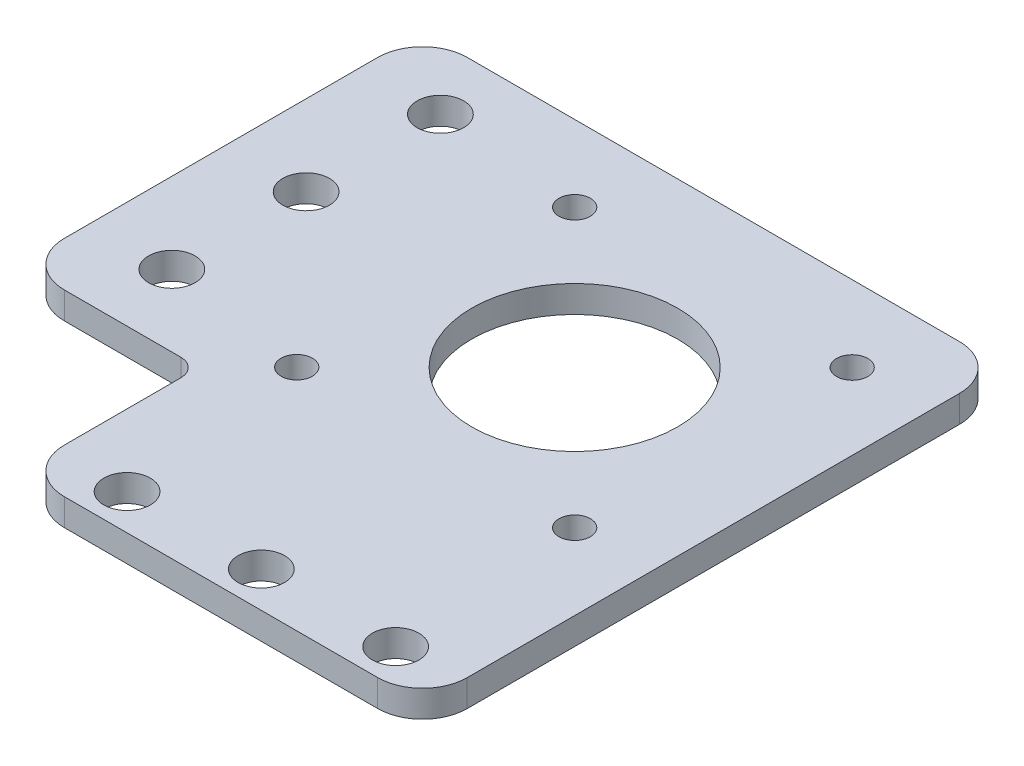
ISO-10303-21;
HEADER;
FILE_DESCRIPTION(('STEP AP214'),'2;1');
FILE_NAME('part.step','',(''),(''),'','','');
FILE_SCHEMA(('AUTOMOTIVE_DESIGN { 1 0 10303 214 1 1 1 1 }'));
ENDSEC;
DATA;
#1=APPLICATION_CONTEXT('core data for automotive mechanical design processes');
#2=APPLICATION_PROTOCOL_DEFINITION('international standard','automotive_design',2000,#1);
#3=PRODUCT_CONTEXT('',#1,'mechanical');
#4=PRODUCT('Part','Part','',(#3));
#5=PRODUCT_RELATED_PRODUCT_CATEGORY('part','',(#4));
#6=PRODUCT_DEFINITION_FORMATION('','',#4);
#7=PRODUCT_DEFINITION_CONTEXT('part definition',#1,'design');
#8=PRODUCT_DEFINITION('design','',#6,#7);
#9=PRODUCT_DEFINITION_SHAPE('','',#8);
#10=(LENGTH_UNIT() NAMED_UNIT(*) SI_UNIT(.MILLI.,.METRE.));
#11=(NAMED_UNIT(*) PLANE_ANGLE_UNIT() SI_UNIT($,.RADIAN.));
#12=(NAMED_UNIT(*) SI_UNIT($,.STERADIAN.) SOLID_ANGLE_UNIT());
#13=UNCERTAINTY_MEASURE_WITH_UNIT(LENGTH_MEASURE(1.E-05),#10,'distance_accuracy_value','');
#14=(GEOMETRIC_REPRESENTATION_CONTEXT(3) GLOBAL_UNCERTAINTY_ASSIGNED_CONTEXT((#13)) GLOBAL_UNIT_ASSIGNED_CONTEXT((#10,
#11,#12)) REPRESENTATION_CONTEXT('',''));
#15=CARTESIAN_POINT('',(0.,0.,0.));
#16=DIRECTION('',(0.,0.,1.));
#17=DIRECTION('',(1.,0.,0.));
#18=AXIS2_PLACEMENT_3D('',#15,#16,#17);
#19=CARTESIAN_POINT('',(20.,-3.,-5.));
#20=DIRECTION('',(-1.,0.,0.));
#21=DIRECTION('',(0.,0.,1.));
#22=AXIS2_PLACEMENT_3D('',#19,#20,#21);
#23=PLANE('',#22);
#24=DIRECTION('',(0.,0.,1.));
#25=VECTOR('',#24,1.);
#26=CARTESIAN_POINT('',(20.,0.,-5.));
#27=LINE('',#26,#25);
#28=CARTESIAN_POINT('',(20.,0.,-23.));
#29=VERTEX_POINT('',#28);
#30=CARTESIAN_POINT('',(20.,0.,-10.));
#31=VERTEX_POINT('',#30);
#32=EDGE_CURVE('E217',#29,#31,#27,.T.);
#33=ORIENTED_EDGE('',*,*,#32,.F.);
#34=DIRECTION('',(0.,1.,0.));
#35=VECTOR('',#34,1.);
#36=CARTESIAN_POINT('',(20.,-3.,-23.));
#37=LINE('',#36,#35);
#38=CARTESIAN_POINT('',(20.,-3.,-23.));
#39=VERTEX_POINT('',#38);
#40=EDGE_CURVE('E60',#29,#39,#37,.F.);
#41=ORIENTED_EDGE('',*,*,#40,.T.);
#42=DIRECTION('',(0.,0.,1.));
#43=VECTOR('',#42,1.);
#44=CARTESIAN_POINT('',(20.,-3.,-5.));
#45=LINE('',#44,#43);
#46=CARTESIAN_POINT('',(20.,-3.,-10.));
#47=VERTEX_POINT('',#46);
#48=EDGE_CURVE('E208',#39,#47,#45,.T.);
#49=ORIENTED_EDGE('',*,*,#48,.T.);
#50=DIRECTION('',(0.,1.,0.));
#51=VECTOR('',#50,1.);
#52=CARTESIAN_POINT('',(20.,-3.,-10.));
#53=LINE('',#52,#51);
#54=EDGE_CURVE('E184',#47,#31,#53,.T.);
#55=ORIENTED_EDGE('',*,*,#54,.T.);
#56=EDGE_LOOP('',(#33,#41,#49,#55));
#57=FACE_BOUND('',#56,.T.);
#58=ADVANCED_FACE('F39',(#57),#23,.T.);
#59=CARTESIAN_POINT('',(20.,-3.,-25.));
#60=DIRECTION('',(0.,0.,1.));
#61=DIRECTION('',(1.,0.,0.));
#62=AXIS2_PLACEMENT_3D('',#59,#60,#61);
#63=PLANE('',#62);
#64=DIRECTION('',(1.,0.,0.));
#65=VECTOR('',#64,1.);
#66=CARTESIAN_POINT('',(20.,-3.,-25.));
#67=LINE('',#66,#65);
#68=CARTESIAN_POINT('',(5.,-3.,-25.));
#69=VERTEX_POINT('',#68);
#70=CARTESIAN_POINT('',(18.,-3.,-25.));
#71=VERTEX_POINT('',#70);
#72=EDGE_CURVE('E151',#69,#71,#67,.T.);
#73=ORIENTED_EDGE('',*,*,#72,.T.);
#74=DIRECTION('',(0.,1.,0.));
#75=VECTOR('',#74,1.);
#76=CARTESIAN_POINT('',(18.,0.,-25.));
#77=LINE('',#76,#75);
#78=CARTESIAN_POINT('',(18.,0.,-25.));
#79=VERTEX_POINT('',#78);
#80=EDGE_CURVE('E196',#71,#79,#77,.T.);
#81=ORIENTED_EDGE('',*,*,#80,.T.);
#82=DIRECTION('',(1.,0.,0.));
#83=VECTOR('',#82,1.);
#84=CARTESIAN_POINT('',(20.,0.,-25.));
#85=LINE('',#84,#83);
#86=CARTESIAN_POINT('',(5.,0.,-25.));
#87=VERTEX_POINT('',#86);
#88=EDGE_CURVE('E158',#87,#79,#85,.T.);
#89=ORIENTED_EDGE('',*,*,#88,.F.);
#90=DIRECTION('',(0.,1.,0.));
#91=VECTOR('',#90,1.);
#92=CARTESIAN_POINT('',(5.,-3.,-25.));
#93=LINE('',#92,#91);
#94=EDGE_CURVE('E182',#87,#69,#93,.F.);
#95=ORIENTED_EDGE('',*,*,#94,.T.);
#96=EDGE_LOOP('',(#73,#81,#89,#95));
#97=FACE_BOUND('',#96,.T.);
#98=ADVANCED_FACE('F202',(#97),#63,.T.);
#99=CARTESIAN_POINT('',(0.,-3.,-25.));
#100=DIRECTION('',(-1.,0.,0.));
#101=DIRECTION('',(0.,0.,1.));
#102=AXIS2_PLACEMENT_3D('',#99,#100,#101);
#103=PLANE('',#102);
#104=DIRECTION('',(0.,0.,1.));
#105=VECTOR('',#104,1.);
#106=CARTESIAN_POINT('',(0.,0.,-25.));
#107=LINE('',#106,#105);
#108=CARTESIAN_POINT('',(0.,0.,-65.));
#109=VERTEX_POINT('',#108);
#110=CARTESIAN_POINT('',(0.,0.,-30.));
#111=VERTEX_POINT('',#110);
#112=EDGE_CURVE('E146',#109,#111,#107,.T.);
#113=ORIENTED_EDGE('',*,*,#112,.F.);
#114=DIRECTION('',(0.,1.,0.));
#115=VECTOR('',#114,1.);
#116=CARTESIAN_POINT('',(0.,-3.,-65.));
#117=LINE('',#116,#115);
#118=CARTESIAN_POINT('',(0.,-3.,-65.));
#119=VERTEX_POINT('',#118);
#120=EDGE_CURVE('E170',#109,#119,#117,.F.);
#121=ORIENTED_EDGE('',*,*,#120,.T.);
#122=DIRECTION('',(0.,0.,1.));
#123=VECTOR('',#122,1.);
#124=CARTESIAN_POINT('',(0.,-3.,-25.));
#125=LINE('',#124,#123);
#126=CARTESIAN_POINT('',(0.,-3.,-30.));
#127=VERTEX_POINT('',#126);
#128=EDGE_CURVE('E155',#119,#127,#125,.T.);
#129=ORIENTED_EDGE('',*,*,#128,.T.);
#130=DIRECTION('',(0.,1.,0.));
#131=VECTOR('',#130,1.);
#132=CARTESIAN_POINT('',(0.,-3.,-30.));
#133=LINE('',#132,#131);
#134=EDGE_CURVE('E167',#127,#111,#133,.T.);
#135=ORIENTED_EDGE('',*,*,#134,.T.);
#136=EDGE_LOOP('',(#113,#121,#129,#135));
#137=FACE_BOUND('',#136,.T.);
#138=ADVANCED_FACE('F347',(#137),#103,.T.);
#139=CARTESIAN_POINT('',(0.,-3.,-70.));
#140=DIRECTION('',(0.,0.,-1.));
#141=DIRECTION('',(-1.,0.,0.));
#142=AXIS2_PLACEMENT_3D('',#139,#140,#141);
#143=PLANE('',#142);
#144=DIRECTION('',(-1.,0.,0.));
#145=VECTOR('',#144,1.);
#146=CARTESIAN_POINT('',(0.,-3.,-70.));
#147=LINE('',#146,#145);
#148=CARTESIAN_POINT('',(60.,-3.,-70.));
#149=VERTEX_POINT('',#148);
#150=CARTESIAN_POINT('',(4.99999999999999,-3.,-70.));
#151=VERTEX_POINT('',#150);
#152=EDGE_CURVE('E222',#149,#151,#147,.T.);
#153=ORIENTED_EDGE('',*,*,#152,.T.);
#154=DIRECTION('',(0.,1.,0.));
#155=VECTOR('',#154,1.);
#156=CARTESIAN_POINT('',(4.99999999999999,-3.,-70.));
#157=LINE('',#156,#155);
#158=CARTESIAN_POINT('',(4.99999999999999,0.,-70.));
#159=VERTEX_POINT('',#158);
#160=EDGE_CURVE('E145',#151,#159,#157,.T.);
#161=ORIENTED_EDGE('',*,*,#160,.T.);
#162=DIRECTION('',(-1.,0.,0.));
#163=VECTOR('',#162,1.);
#164=CARTESIAN_POINT('',(0.,0.,-70.));
#165=LINE('',#164,#163);
#166=CARTESIAN_POINT('',(60.,0.,-70.));
#167=VERTEX_POINT('',#166);
#168=EDGE_CURVE('E128',#167,#159,#165,.T.);
#169=ORIENTED_EDGE('',*,*,#168,.F.);
#170=DIRECTION('',(0.,1.,0.));
#171=VECTOR('',#170,1.);
#172=CARTESIAN_POINT('',(60.,-3.,-70.));
#173=LINE('',#172,#171);
#174=EDGE_CURVE('E142',#167,#149,#173,.F.);
#175=ORIENTED_EDGE('',*,*,#174,.T.);
#176=EDGE_LOOP('',(#153,#161,#169,#175));
#177=FACE_BOUND('',#176,.T.);
#178=ADVANCED_FACE('F141',(#177),#143,.T.);
#179=CARTESIAN_POINT('',(65.,-3.,-70.));
#180=DIRECTION('',(1.,0.,0.));
#181=DIRECTION('',(0.,0.,-1.));
#182=AXIS2_PLACEMENT_3D('',#179,#180,#181);
#183=PLANE('',#182);
#184=DIRECTION('',(0.,0.,-1.));
#185=VECTOR('',#184,1.);
#186=CARTESIAN_POINT('',(65.,-3.,-70.));
#187=LINE('',#186,#185);
#188=CARTESIAN_POINT('',(65.,-3.,-10.));
#189=VERTEX_POINT('',#188);
#190=CARTESIAN_POINT('',(65.,-3.,-65.));
#191=VERTEX_POINT('',#190);
#192=EDGE_CURVE('E224',#189,#191,#187,.T.);
#193=ORIENTED_EDGE('',*,*,#192,.T.);
#194=DIRECTION('',(0.,1.,0.));
#195=VECTOR('',#194,1.);
#196=CARTESIAN_POINT('',(65.,-3.,-65.));
#197=LINE('',#196,#195);
#198=CARTESIAN_POINT('',(65.,0.,-65.));
#199=VERTEX_POINT('',#198);
#200=EDGE_CURVE('E194',#191,#199,#197,.T.);
#201=ORIENTED_EDGE('',*,*,#200,.T.);
#202=DIRECTION('',(0.,0.,-1.));
#203=VECTOR('',#202,1.);
#204=CARTESIAN_POINT('',(65.,0.,-70.));
#205=LINE('',#204,#203);
#206=CARTESIAN_POINT('',(65.,0.,-10.));
#207=VERTEX_POINT('',#206);
#208=EDGE_CURVE('E130',#207,#199,#205,.T.);
#209=ORIENTED_EDGE('',*,*,#208,.F.);
#210=DIRECTION('',(0.,1.,0.));
#211=VECTOR('',#210,1.);
#212=CARTESIAN_POINT('',(65.,-3.,-10.));
#213=LINE('',#212,#211);
#214=EDGE_CURVE('E192',#207,#189,#213,.F.);
#215=ORIENTED_EDGE('',*,*,#214,.T.);
#216=EDGE_LOOP('',(#193,#201,#209,#215));
#217=FACE_BOUND('',#216,.T.);
#218=ADVANCED_FACE('F385',(#217),#183,.T.);
#219=CARTESIAN_POINT('',(65.,-3.,-5.00000000000001));
#220=DIRECTION('',(0.,0.,1.));
#221=DIRECTION('',(1.,0.,0.));
#222=AXIS2_PLACEMENT_3D('',#219,#220,#221);
#223=PLANE('',#222);
#224=DIRECTION('',(1.,0.,0.));
#225=VECTOR('',#224,1.);
#226=CARTESIAN_POINT('',(65.,0.,-5.00000000000001));
#227=LINE('',#226,#225);
#228=CARTESIAN_POINT('',(25.,0.,-5.));
#229=VERTEX_POINT('',#228);
#230=CARTESIAN_POINT('',(60.,0.,-5.00000000000001));
#231=VERTEX_POINT('',#230);
#232=EDGE_CURVE('E214',#229,#231,#227,.T.);
#233=ORIENTED_EDGE('',*,*,#232,.F.);
#234=DIRECTION('',(0.,1.,0.));
#235=VECTOR('',#234,1.);
#236=CARTESIAN_POINT('',(25.,-3.,-5.));
#237=LINE('',#236,#235);
#238=CARTESIAN_POINT('',(25.,-3.,-5.));
#239=VERTEX_POINT('',#238);
#240=EDGE_CURVE('E190',#229,#239,#237,.F.);
#241=ORIENTED_EDGE('',*,*,#240,.T.);
#242=DIRECTION('',(1.,0.,0.));
#243=VECTOR('',#242,1.);
#244=CARTESIAN_POINT('',(65.,-3.,-5.00000000000001));
#245=LINE('',#244,#243);
#246=CARTESIAN_POINT('',(60.,-3.,-5.00000000000001));
#247=VERTEX_POINT('',#246);
#248=EDGE_CURVE('E209',#239,#247,#245,.T.);
#249=ORIENTED_EDGE('',*,*,#248,.T.);
#250=DIRECTION('',(0.,1.,0.));
#251=VECTOR('',#250,1.);
#252=CARTESIAN_POINT('',(60.,-3.,-5.00000000000001));
#253=LINE('',#252,#251);
#254=EDGE_CURVE('E187',#247,#231,#253,.T.);
#255=ORIENTED_EDGE('',*,*,#254,.T.);
#256=EDGE_LOOP('',(#233,#241,#249,#255));
#257=FACE_BOUND('',#256,.T.);
#258=ADVANCED_FACE('F351',(#257),#223,.T.);
#259=CARTESIAN_POINT('',(0.,-3.,0.));
#260=DIRECTION('',(0.,1.,0.));
#261=DIRECTION('',(0.,0.,1.));
#262=AXIS2_PLACEMENT_3D('',#259,#260,#261);
#263=PLANE('',#262);
#264=CARTESIAN_POINT('',(41.,-3.,-46.));
#265=DIRECTION('',(0.,1.,0.));
#266=DIRECTION('',(0.,0.,1.));
#267=AXIS2_PLACEMENT_3D('',#264,#265,#266);
#268=CIRCLE('',#267,11.5);
#269=CARTESIAN_POINT('',(41.,-3.,-34.5));
#270=VERTEX_POINT('',#269);
#271=EDGE_CURVE('E286',#270,#270,#268,.T.);
#272=ORIENTED_EDGE('',*,*,#271,.T.);
#273=EDGE_LOOP('',(#272));
#274=FACE_BOUND('',#273,.T.);
#275=CARTESIAN_POINT('',(25.4491798195983,-3.,-30.5022938972961));
#276=DIRECTION('',(0.,1.,0.));
#277=DIRECTION('',(0.,0.,1.));
#278=AXIS2_PLACEMENT_3D('',#275,#276,#277);
#279=CIRCLE('',#278,1.75);
#280=CARTESIAN_POINT('',(25.4491798195983,-3.,-28.7522938972961));
#281=VERTEX_POINT('',#280);
#282=EDGE_CURVE('E280',#281,#281,#279,.T.);
#283=ORIENTED_EDGE('',*,*,#282,.T.);
#284=EDGE_LOOP('',(#283));
#285=FACE_BOUND('',#284,.T.);
#286=CARTESIAN_POINT('',(56.5,-3.,-30.5));
#287=DIRECTION('',(0.,1.,0.));
#288=DIRECTION('',(0.,0.,1.));
#289=AXIS2_PLACEMENT_3D('',#286,#287,#288);
#290=CIRCLE('',#289,1.75);
#291=CARTESIAN_POINT('',(56.5,-3.,-28.75));
#292=VERTEX_POINT('',#291);
#293=EDGE_CURVE('E274',#292,#292,#290,.T.);
#294=ORIENTED_EDGE('',*,*,#293,.T.);
#295=EDGE_LOOP('',(#294));
#296=FACE_BOUND('',#295,.T.);
#297=CARTESIAN_POINT('',(56.5,-3.,-61.5));
#298=DIRECTION('',(0.,1.,0.));
#299=DIRECTION('',(0.,0.,1.));
#300=AXIS2_PLACEMENT_3D('',#297,#298,#299);
#301=CIRCLE('',#300,1.75);
#302=CARTESIAN_POINT('',(56.5,-3.,-59.75));
#303=VERTEX_POINT('',#302);
#304=EDGE_CURVE('E268',#303,#303,#301,.T.);
#305=ORIENTED_EDGE('',*,*,#304,.T.);
#306=EDGE_LOOP('',(#305));
#307=FACE_BOUND('',#306,.T.);
#308=CARTESIAN_POINT('',(25.5,-3.,-61.5));
#309=DIRECTION('',(0.,1.,0.));
#310=DIRECTION('',(0.,0.,1.));
#311=AXIS2_PLACEMENT_3D('',#308,#309,#310);
#312=CIRCLE('',#311,1.75);
#313=CARTESIAN_POINT('',(25.5,-3.,-59.75));
#314=VERTEX_POINT('',#313);
#315=EDGE_CURVE('E262',#314,#314,#312,.T.);
#316=ORIENTED_EDGE('',*,*,#315,.T.);
#317=EDGE_LOOP('',(#316));
#318=FACE_BOUND('',#317,.T.);
#319=CARTESIAN_POINT('',(8.99999999999984,-3.,-63.));
#320=DIRECTION('',(0.,1.,0.));
#321=DIRECTION('',(0.,0.,1.));
#322=AXIS2_PLACEMENT_3D('',#319,#320,#321);
#323=CIRCLE('',#322,2.60000000000001);
#324=CARTESIAN_POINT('',(8.99999999999984,-3.,-60.4));
#325=VERTEX_POINT('',#324);
#326=EDGE_CURVE('E256',#325,#325,#323,.T.);
#327=ORIENTED_EDGE('',*,*,#326,.T.);
#328=EDGE_LOOP('',(#327));
#329=FACE_BOUND('',#328,.T.);
#330=CARTESIAN_POINT('',(8.9999999999999,-3.,-48.));
#331=DIRECTION('',(0.,1.,0.));
#332=DIRECTION('',(0.,0.,1.));
#333=AXIS2_PLACEMENT_3D('',#330,#331,#332);
#334=CIRCLE('',#333,2.6);
#335=CARTESIAN_POINT('',(8.9999999999999,-3.,-45.4));
#336=VERTEX_POINT('',#335);
#337=EDGE_CURVE('E250',#336,#336,#334,.T.);
#338=ORIENTED_EDGE('',*,*,#337,.T.);
#339=EDGE_LOOP('',(#338));
#340=FACE_BOUND('',#339,.T.);
#341=CARTESIAN_POINT('',(9.,-3.,-33.));
#342=DIRECTION('',(0.,1.,0.));
#343=DIRECTION('',(0.,0.,1.));
#344=AXIS2_PLACEMENT_3D('',#341,#342,#343);
#345=CIRCLE('',#344,2.6);
#346=CARTESIAN_POINT('',(9.,-3.,-30.4));
#347=VERTEX_POINT('',#346);
#348=EDGE_CURVE('E244',#347,#347,#345,.T.);
#349=ORIENTED_EDGE('',*,*,#348,.T.);
#350=EDGE_LOOP('',(#349));
#351=FACE_BOUND('',#350,.T.);
#352=CARTESIAN_POINT('',(58.,-3.,-8.99999999999999));
#353=DIRECTION('',(0.,1.,0.));
#354=DIRECTION('',(0.,0.,1.));
#355=AXIS2_PLACEMENT_3D('',#352,#353,#354);
#356=CIRCLE('',#355,2.59999999999997);
#357=CARTESIAN_POINT('',(58.,-3.,-6.40000000000003));
#358=VERTEX_POINT('',#357);
#359=EDGE_CURVE('E238',#358,#358,#356,.T.);
#360=ORIENTED_EDGE('',*,*,#359,.T.);
#361=EDGE_LOOP('',(#360));
#362=FACE_BOUND('',#361,.T.);
#363=CARTESIAN_POINT('',(43.,-3.,-8.99999999999999));
#364=DIRECTION('',(0.,1.,0.));
#365=DIRECTION('',(0.,0.,1.));
#366=AXIS2_PLACEMENT_3D('',#363,#364,#365);
#367=CIRCLE('',#366,2.6);
#368=CARTESIAN_POINT('',(43.,-3.,-6.39999999999999));
#369=VERTEX_POINT('',#368);
#370=EDGE_CURVE('E232',#369,#369,#367,.T.);
#371=ORIENTED_EDGE('',*,*,#370,.T.);
#372=EDGE_LOOP('',(#371));
#373=FACE_BOUND('',#372,.T.);
#374=CARTESIAN_POINT('',(28.,-3.,-8.99999999999999));
#375=DIRECTION('',(0.,1.,0.));
#376=DIRECTION('',(0.,0.,1.));
#377=AXIS2_PLACEMENT_3D('',#374,#375,#376);
#378=CIRCLE('',#377,2.6);
#379=CARTESIAN_POINT('',(28.,-3.,-6.39999999999999));
#380=VERTEX_POINT('',#379);
#381=EDGE_CURVE('E218',#380,#380,#378,.T.);
#382=ORIENTED_EDGE('',*,*,#381,.T.);
#383=EDGE_LOOP('',(#382));
#384=FACE_BOUND('',#383,.T.);
#385=ORIENTED_EDGE('',*,*,#128,.F.);
#386=CARTESIAN_POINT('',(4.99999999999999,-3.,-65.));
#387=DIRECTION('',(0.,1.,0.));
#388=DIRECTION('',(0.,0.,1.));
#389=AXIS2_PLACEMENT_3D('',#386,#387,#388);
#390=CIRCLE('',#389,5.);
#391=EDGE_CURVE('E180',#119,#151,#390,.F.);
#392=ORIENTED_EDGE('',*,*,#391,.T.);
#393=ORIENTED_EDGE('',*,*,#152,.F.);
#394=CARTESIAN_POINT('',(60.,-3.,-65.));
#395=DIRECTION('',(0.,1.,0.));
#396=DIRECTION('',(0.,0.,1.));
#397=AXIS2_PLACEMENT_3D('',#394,#395,#396);
#398=CIRCLE('',#397,5.);
#399=EDGE_CURVE('E150',#149,#191,#398,.F.);
#400=ORIENTED_EDGE('',*,*,#399,.T.);
#401=ORIENTED_EDGE('',*,*,#192,.F.);
#402=CARTESIAN_POINT('',(60.,-3.,-10.));
#403=DIRECTION('',(0.,1.,0.));
#404=DIRECTION('',(0.,0.,1.));
#405=AXIS2_PLACEMENT_3D('',#402,#403,#404);
#406=CIRCLE('',#405,5.);
#407=EDGE_CURVE('E172',#189,#247,#406,.F.);
#408=ORIENTED_EDGE('',*,*,#407,.T.);
#409=ORIENTED_EDGE('',*,*,#248,.F.);
#410=CARTESIAN_POINT('',(25.,-3.,-10.));
#411=DIRECTION('',(0.,1.,0.));
#412=DIRECTION('',(0.,0.,1.));
#413=AXIS2_PLACEMENT_3D('',#410,#411,#412);
#414=CIRCLE('',#413,5.);
#415=EDGE_CURVE('E175',#239,#47,#414,.F.);
#416=ORIENTED_EDGE('',*,*,#415,.T.);
#417=ORIENTED_EDGE('',*,*,#48,.F.);
#418=CARTESIAN_POINT('',(18.,-3.,-23.));
#419=DIRECTION('',(0.,1.,0.));
#420=DIRECTION('',(0.,0.,1.));
#421=AXIS2_PLACEMENT_3D('',#418,#419,#420);
#422=CIRCLE('',#421,2.);
#423=EDGE_CURVE('E11',#39,#71,#422,.T.);
#424=ORIENTED_EDGE('',*,*,#423,.T.);
#425=ORIENTED_EDGE('',*,*,#72,.F.);
#426=CARTESIAN_POINT('',(5.,-3.,-30.));
#427=DIRECTION('',(0.,1.,0.));
#428=DIRECTION('',(0.,0.,1.));
#429=AXIS2_PLACEMENT_3D('',#426,#427,#428);
#430=CIRCLE('',#429,5.);
#431=EDGE_CURVE('E178',#69,#127,#430,.F.);
#432=ORIENTED_EDGE('',*,*,#431,.T.);
#433=EDGE_LOOP('',(#385,#392,#393,#400,#401,#408,#409,#416,#417,#424,#425,#432));
#434=FACE_BOUND('',#433,.T.);
#435=ADVANCED_FACE('F295',(#274,#285,#296,#307,#318,#329,#340,#351,#362,#373,#384,#434),#263,.F.);
#436=CARTESIAN_POINT('',(0.,0.,0.));
#437=DIRECTION('',(0.,1.,0.));
#438=DIRECTION('',(0.,0.,1.));
#439=AXIS2_PLACEMENT_3D('',#436,#437,#438);
#440=PLANE('',#439);
#441=CARTESIAN_POINT('',(41.,0.,-46.));
#442=DIRECTION('',(0.,1.,0.));
#443=DIRECTION('',(0.,0.,1.));
#444=AXIS2_PLACEMENT_3D('',#441,#442,#443);
#445=CIRCLE('',#444,11.5);
#446=CARTESIAN_POINT('',(41.,0.,-34.5));
#447=VERTEX_POINT('',#446);
#448=EDGE_CURVE('E289',#447,#447,#445,.T.);
#449=ORIENTED_EDGE('',*,*,#448,.F.);
#450=EDGE_LOOP('',(#449));
#451=FACE_BOUND('',#450,.T.);
#452=CARTESIAN_POINT('',(25.4491798195983,0.,-30.5022938972961));
#453=DIRECTION('',(0.,1.,0.));
#454=DIRECTION('',(0.,0.,1.));
#455=AXIS2_PLACEMENT_3D('',#452,#453,#454);
#456=CIRCLE('',#455,1.75);
#457=CARTESIAN_POINT('',(25.4491798195983,0.,-28.7522938972961));
#458=VERTEX_POINT('',#457);
#459=EDGE_CURVE('E283',#458,#458,#456,.T.);
#460=ORIENTED_EDGE('',*,*,#459,.F.);
#461=EDGE_LOOP('',(#460));
#462=FACE_BOUND('',#461,.T.);
#463=CARTESIAN_POINT('',(56.5,0.,-30.5));
#464=DIRECTION('',(0.,1.,0.));
#465=DIRECTION('',(0.,0.,1.));
#466=AXIS2_PLACEMENT_3D('',#463,#464,#465);
#467=CIRCLE('',#466,1.75);
#468=CARTESIAN_POINT('',(56.5,0.,-28.75));
#469=VERTEX_POINT('',#468);
#470=EDGE_CURVE('E277',#469,#469,#467,.T.);
#471=ORIENTED_EDGE('',*,*,#470,.F.);
#472=EDGE_LOOP('',(#471));
#473=FACE_BOUND('',#472,.T.);
#474=CARTESIAN_POINT('',(56.5,0.,-61.5));
#475=DIRECTION('',(0.,1.,0.));
#476=DIRECTION('',(0.,0.,1.));
#477=AXIS2_PLACEMENT_3D('',#474,#475,#476);
#478=CIRCLE('',#477,1.75);
#479=CARTESIAN_POINT('',(56.5,0.,-59.75));
#480=VERTEX_POINT('',#479);
#481=EDGE_CURVE('E271',#480,#480,#478,.T.);
#482=ORIENTED_EDGE('',*,*,#481,.F.);
#483=EDGE_LOOP('',(#482));
#484=FACE_BOUND('',#483,.T.);
#485=CARTESIAN_POINT('',(25.5,0.,-61.5));
#486=DIRECTION('',(0.,1.,0.));
#487=DIRECTION('',(0.,0.,1.));
#488=AXIS2_PLACEMENT_3D('',#485,#486,#487);
#489=CIRCLE('',#488,1.75);
#490=CARTESIAN_POINT('',(25.5,0.,-59.75));
#491=VERTEX_POINT('',#490);
#492=EDGE_CURVE('E265',#491,#491,#489,.T.);
#493=ORIENTED_EDGE('',*,*,#492,.F.);
#494=EDGE_LOOP('',(#493));
#495=FACE_BOUND('',#494,.T.);
#496=CARTESIAN_POINT('',(8.99999999999984,0.,-63.));
#497=DIRECTION('',(0.,1.,0.));
#498=DIRECTION('',(0.,0.,1.));
#499=AXIS2_PLACEMENT_3D('',#496,#497,#498);
#500=CIRCLE('',#499,2.60000000000001);
#501=CARTESIAN_POINT('',(8.99999999999984,0.,-60.4));
#502=VERTEX_POINT('',#501);
#503=EDGE_CURVE('E259',#502,#502,#500,.T.);
#504=ORIENTED_EDGE('',*,*,#503,.F.);
#505=EDGE_LOOP('',(#504));
#506=FACE_BOUND('',#505,.T.);
#507=CARTESIAN_POINT('',(8.9999999999999,0.,-48.));
#508=DIRECTION('',(0.,1.,0.));
#509=DIRECTION('',(0.,0.,1.));
#510=AXIS2_PLACEMENT_3D('',#507,#508,#509);
#511=CIRCLE('',#510,2.6);
#512=CARTESIAN_POINT('',(8.9999999999999,0.,-45.4));
#513=VERTEX_POINT('',#512);
#514=EDGE_CURVE('E253',#513,#513,#511,.T.);
#515=ORIENTED_EDGE('',*,*,#514,.F.);
#516=EDGE_LOOP('',(#515));
#517=FACE_BOUND('',#516,.T.);
#518=CARTESIAN_POINT('',(9.,0.,-33.));
#519=DIRECTION('',(0.,1.,0.));
#520=DIRECTION('',(0.,0.,1.));
#521=AXIS2_PLACEMENT_3D('',#518,#519,#520);
#522=CIRCLE('',#521,2.6);
#523=CARTESIAN_POINT('',(9.,0.,-30.4));
#524=VERTEX_POINT('',#523);
#525=EDGE_CURVE('E247',#524,#524,#522,.T.);
#526=ORIENTED_EDGE('',*,*,#525,.F.);
#527=EDGE_LOOP('',(#526));
#528=FACE_BOUND('',#527,.T.);
#529=CARTESIAN_POINT('',(58.,0.,-8.99999999999999));
#530=DIRECTION('',(0.,1.,0.));
#531=DIRECTION('',(0.,0.,1.));
#532=AXIS2_PLACEMENT_3D('',#529,#530,#531);
#533=CIRCLE('',#532,2.59999999999997);
#534=CARTESIAN_POINT('',(58.,0.,-6.40000000000003));
#535=VERTEX_POINT('',#534);
#536=EDGE_CURVE('E241',#535,#535,#533,.T.);
#537=ORIENTED_EDGE('',*,*,#536,.F.);
#538=EDGE_LOOP('',(#537));
#539=FACE_BOUND('',#538,.T.);
#540=CARTESIAN_POINT('',(43.,0.,-8.99999999999999));
#541=DIRECTION('',(0.,1.,0.));
#542=DIRECTION('',(0.,0.,1.));
#543=AXIS2_PLACEMENT_3D('',#540,#541,#542);
#544=CIRCLE('',#543,2.6);
#545=CARTESIAN_POINT('',(43.,0.,-6.39999999999999));
#546=VERTEX_POINT('',#545);
#547=EDGE_CURVE('E235',#546,#546,#544,.T.);
#548=ORIENTED_EDGE('',*,*,#547,.F.);
#549=EDGE_LOOP('',(#548));
#550=FACE_BOUND('',#549,.T.);
#551=CARTESIAN_POINT('',(28.,0.,-8.99999999999999));
#552=DIRECTION('',(0.,1.,0.));
#553=DIRECTION('',(0.,0.,1.));
#554=AXIS2_PLACEMENT_3D('',#551,#552,#553);
#555=CIRCLE('',#554,2.6);
#556=CARTESIAN_POINT('',(28.,0.,-6.39999999999999));
#557=VERTEX_POINT('',#556);
#558=EDGE_CURVE('E229',#557,#557,#555,.T.);
#559=ORIENTED_EDGE('',*,*,#558,.F.);
#560=EDGE_LOOP('',(#559));
#561=FACE_BOUND('',#560,.T.);
#562=ORIENTED_EDGE('',*,*,#168,.T.);
#563=CARTESIAN_POINT('',(4.99999999999999,0.,-65.));
#564=DIRECTION('',(0.,1.,0.));
#565=DIRECTION('',(0.,0.,1.));
#566=AXIS2_PLACEMENT_3D('',#563,#564,#565);
#567=CIRCLE('',#566,5.);
#568=EDGE_CURVE('E165',#159,#109,#567,.T.);
#569=ORIENTED_EDGE('',*,*,#568,.T.);
#570=ORIENTED_EDGE('',*,*,#112,.T.);
#571=CARTESIAN_POINT('',(5.,0.,-30.));
#572=DIRECTION('',(0.,1.,0.));
#573=DIRECTION('',(0.,0.,1.));
#574=AXIS2_PLACEMENT_3D('',#571,#572,#573);
#575=CIRCLE('',#574,5.);
#576=EDGE_CURVE('E163',#111,#87,#575,.T.);
#577=ORIENTED_EDGE('',*,*,#576,.T.);
#578=ORIENTED_EDGE('',*,*,#88,.T.);
#579=CARTESIAN_POINT('',(18.,0.,-23.));
#580=DIRECTION('',(0.,1.,0.));
#581=DIRECTION('',(0.,0.,1.));
#582=AXIS2_PLACEMENT_3D('',#579,#580,#581);
#583=CIRCLE('',#582,2.);
#584=EDGE_CURVE('E47',#79,#29,#583,.F.);
#585=ORIENTED_EDGE('',*,*,#584,.T.);
#586=ORIENTED_EDGE('',*,*,#32,.T.);
#587=CARTESIAN_POINT('',(25.,0.,-10.));
#588=DIRECTION('',(0.,1.,0.));
#589=DIRECTION('',(0.,0.,1.));
#590=AXIS2_PLACEMENT_3D('',#587,#588,#589);
#591=CIRCLE('',#590,5.);
#592=EDGE_CURVE('E135',#31,#229,#591,.T.);
#593=ORIENTED_EDGE('',*,*,#592,.T.);
#594=ORIENTED_EDGE('',*,*,#232,.T.);
#595=CARTESIAN_POINT('',(60.,0.,-10.));
#596=DIRECTION('',(0.,1.,0.));
#597=DIRECTION('',(0.,0.,1.));
#598=AXIS2_PLACEMENT_3D('',#595,#596,#597);
#599=CIRCLE('',#598,5.);
#600=EDGE_CURVE('E136',#231,#207,#599,.T.);
#601=ORIENTED_EDGE('',*,*,#600,.T.);
#602=ORIENTED_EDGE('',*,*,#208,.T.);
#603=CARTESIAN_POINT('',(60.,0.,-65.));
#604=DIRECTION('',(0.,1.,0.));
#605=DIRECTION('',(0.,0.,1.));
#606=AXIS2_PLACEMENT_3D('',#603,#604,#605);
#607=CIRCLE('',#606,5.);
#608=EDGE_CURVE('E125',#199,#167,#607,.T.);
#609=ORIENTED_EDGE('',*,*,#608,.T.);
#610=EDGE_LOOP('',(#562,#569,#570,#577,#578,#585,#586,#593,#594,#601,#602,#609));
#611=FACE_BOUND('',#610,.T.);
#612=ADVANCED_FACE('F127',(#451,#462,#473,#484,#495,#506,#517,#528,#539,#550,#561,#611),#440,.T.);
#613=CARTESIAN_POINT('',(28.,-3.,-8.99999999999999));
#614=DIRECTION('',(0.,1.,0.));
#615=DIRECTION('',(0.,0.,1.));
#616=AXIS2_PLACEMENT_3D('',#613,#614,#615);
#617=CYLINDRICAL_SURFACE('',#616,2.6);
#618=ORIENTED_EDGE('',*,*,#381,.F.);
#619=EDGE_LOOP('',(#618));
#620=FACE_BOUND('',#619,.T.);
#621=ORIENTED_EDGE('',*,*,#558,.T.);
#622=EDGE_LOOP('',(#621));
#623=FACE_BOUND('',#622,.T.);
#624=ADVANCED_FACE('F308',(#620,#623),#617,.F.);
#625=CARTESIAN_POINT('',(43.,-3.,-8.99999999999999));
#626=DIRECTION('',(0.,1.,0.));
#627=DIRECTION('',(0.,0.,1.));
#628=AXIS2_PLACEMENT_3D('',#625,#626,#627);
#629=CYLINDRICAL_SURFACE('',#628,2.6);
#630=ORIENTED_EDGE('',*,*,#370,.F.);
#631=EDGE_LOOP('',(#630));
#632=FACE_BOUND('',#631,.T.);
#633=ORIENTED_EDGE('',*,*,#547,.T.);
#634=EDGE_LOOP('',(#633));
#635=FACE_BOUND('',#634,.T.);
#636=ADVANCED_FACE('F331',(#632,#635),#629,.F.);
#637=CARTESIAN_POINT('',(58.,-3.,-8.99999999999999));
#638=DIRECTION('',(0.,1.,0.));
#639=DIRECTION('',(0.,0.,1.));
#640=AXIS2_PLACEMENT_3D('',#637,#638,#639);
#641=CYLINDRICAL_SURFACE('',#640,2.59999999999997);
#642=ORIENTED_EDGE('',*,*,#359,.F.);
#643=EDGE_LOOP('',(#642));
#644=FACE_BOUND('',#643,.T.);
#645=ORIENTED_EDGE('',*,*,#536,.T.);
#646=EDGE_LOOP('',(#645));
#647=FACE_BOUND('',#646,.T.);
#648=ADVANCED_FACE('F337',(#644,#647),#641,.F.);
#649=CARTESIAN_POINT('',(9.,-3.,-33.));
#650=DIRECTION('',(0.,1.,0.));
#651=DIRECTION('',(0.,0.,1.));
#652=AXIS2_PLACEMENT_3D('',#649,#650,#651);
#653=CYLINDRICAL_SURFACE('',#652,2.6);
#654=ORIENTED_EDGE('',*,*,#348,.F.);
#655=EDGE_LOOP('',(#654));
#656=FACE_BOUND('',#655,.T.);
#657=ORIENTED_EDGE('',*,*,#525,.T.);
#658=EDGE_LOOP('',(#657));
#659=FACE_BOUND('',#658,.T.);
#660=ADVANCED_FACE('F511',(#656,#659),#653,.F.);
#661=CARTESIAN_POINT('',(8.9999999999999,-3.,-48.));
#662=DIRECTION('',(0.,1.,0.));
#663=DIRECTION('',(0.,0.,1.));
#664=AXIS2_PLACEMENT_3D('',#661,#662,#663);
#665=CYLINDRICAL_SURFACE('',#664,2.6);
#666=ORIENTED_EDGE('',*,*,#337,.F.);
#667=EDGE_LOOP('',(#666));
#668=FACE_BOUND('',#667,.T.);
#669=ORIENTED_EDGE('',*,*,#514,.T.);
#670=EDGE_LOOP('',(#669));
#671=FACE_BOUND('',#670,.T.);
#672=ADVANCED_FACE('F500',(#668,#671),#665,.F.);
#673=CARTESIAN_POINT('',(8.99999999999984,-3.,-63.));
#674=DIRECTION('',(0.,1.,0.));
#675=DIRECTION('',(0.,0.,1.));
#676=AXIS2_PLACEMENT_3D('',#673,#674,#675);
#677=CYLINDRICAL_SURFACE('',#676,2.60000000000001);
#678=ORIENTED_EDGE('',*,*,#326,.F.);
#679=EDGE_LOOP('',(#678));
#680=FACE_BOUND('',#679,.T.);
#681=ORIENTED_EDGE('',*,*,#503,.T.);
#682=EDGE_LOOP('',(#681));
#683=FACE_BOUND('',#682,.T.);
#684=ADVANCED_FACE('F489',(#680,#683),#677,.F.);
#685=CARTESIAN_POINT('',(25.5,-3.,-61.5));
#686=DIRECTION('',(0.,1.,0.));
#687=DIRECTION('',(0.,0.,1.));
#688=AXIS2_PLACEMENT_3D('',#685,#686,#687);
#689=CYLINDRICAL_SURFACE('',#688,1.75);
#690=ORIENTED_EDGE('',*,*,#315,.F.);
#691=EDGE_LOOP('',(#690));
#692=FACE_BOUND('',#691,.T.);
#693=ORIENTED_EDGE('',*,*,#492,.T.);
#694=EDGE_LOOP('',(#693));
#695=FACE_BOUND('',#694,.T.);
#696=ADVANCED_FACE('F478',(#692,#695),#689,.F.);
#697=CARTESIAN_POINT('',(56.5,-3.,-61.5));
#698=DIRECTION('',(0.,1.,0.));
#699=DIRECTION('',(0.,0.,1.));
#700=AXIS2_PLACEMENT_3D('',#697,#698,#699);
#701=CYLINDRICAL_SURFACE('',#700,1.75);
#702=ORIENTED_EDGE('',*,*,#304,.F.);
#703=EDGE_LOOP('',(#702));
#704=FACE_BOUND('',#703,.T.);
#705=ORIENTED_EDGE('',*,*,#481,.T.);
#706=EDGE_LOOP('',(#705));
#707=FACE_BOUND('',#706,.T.);
#708=ADVANCED_FACE('F467',(#704,#707),#701,.F.);
#709=CARTESIAN_POINT('',(56.5,-3.,-30.5));
#710=DIRECTION('',(0.,1.,0.));
#711=DIRECTION('',(0.,0.,1.));
#712=AXIS2_PLACEMENT_3D('',#709,#710,#711);
#713=CYLINDRICAL_SURFACE('',#712,1.75);
#714=ORIENTED_EDGE('',*,*,#293,.F.);
#715=EDGE_LOOP('',(#714));
#716=FACE_BOUND('',#715,.T.);
#717=ORIENTED_EDGE('',*,*,#470,.T.);
#718=EDGE_LOOP('',(#717));
#719=FACE_BOUND('',#718,.T.);
#720=ADVANCED_FACE('F456',(#716,#719),#713,.F.);
#721=CARTESIAN_POINT('',(25.4491798195983,-3.,-30.5022938972961));
#722=DIRECTION('',(0.,1.,0.));
#723=DIRECTION('',(0.,0.,1.));
#724=AXIS2_PLACEMENT_3D('',#721,#722,#723);
#725=CYLINDRICAL_SURFACE('',#724,1.75);
#726=ORIENTED_EDGE('',*,*,#282,.F.);
#727=EDGE_LOOP('',(#726));
#728=FACE_BOUND('',#727,.T.);
#729=ORIENTED_EDGE('',*,*,#459,.T.);
#730=EDGE_LOOP('',(#729));
#731=FACE_BOUND('',#730,.T.);
#732=ADVANCED_FACE('F302',(#728,#731),#725,.F.);
#733=CARTESIAN_POINT('',(41.,-3.,-46.));
#734=DIRECTION('',(0.,1.,0.));
#735=DIRECTION('',(0.,0.,1.));
#736=AXIS2_PLACEMENT_3D('',#733,#734,#735);
#737=CYLINDRICAL_SURFACE('',#736,11.5);
#738=ORIENTED_EDGE('',*,*,#271,.F.);
#739=EDGE_LOOP('',(#738));
#740=FACE_BOUND('',#739,.T.);
#741=ORIENTED_EDGE('',*,*,#448,.T.);
#742=EDGE_LOOP('',(#741));
#743=FACE_BOUND('',#742,.T.);
#744=ADVANCED_FACE('F298',(#740,#743),#737,.F.);
#745=CARTESIAN_POINT('',(4.99999999999999,-3.,-65.));
#746=DIRECTION('',(0.,1.,0.));
#747=DIRECTION('',(0.,0.,1.));
#748=AXIS2_PLACEMENT_3D('',#745,#746,#747);
#749=CYLINDRICAL_SURFACE('',#748,5.);
#750=ORIENTED_EDGE('',*,*,#391,.F.);
#751=ORIENTED_EDGE('',*,*,#120,.F.);
#752=ORIENTED_EDGE('',*,*,#568,.F.);
#753=ORIENTED_EDGE('',*,*,#160,.F.);
#754=EDGE_LOOP('',(#750,#751,#752,#753));
#755=FACE_BOUND('',#754,.T.);
#756=ADVANCED_FACE('F301',(#755),#749,.T.);
#757=CARTESIAN_POINT('',(5.,-3.,-30.));
#758=DIRECTION('',(0.,1.,0.));
#759=DIRECTION('',(0.,0.,1.));
#760=AXIS2_PLACEMENT_3D('',#757,#758,#759);
#761=CYLINDRICAL_SURFACE('',#760,5.);
#762=ORIENTED_EDGE('',*,*,#431,.F.);
#763=ORIENTED_EDGE('',*,*,#94,.F.);
#764=ORIENTED_EDGE('',*,*,#576,.F.);
#765=ORIENTED_EDGE('',*,*,#134,.F.);
#766=EDGE_LOOP('',(#762,#763,#764,#765));
#767=FACE_BOUND('',#766,.T.);
#768=ADVANCED_FACE('F355',(#767),#761,.T.);
#769=CARTESIAN_POINT('',(25.,-3.,-10.));
#770=DIRECTION('',(0.,1.,0.));
#771=DIRECTION('',(0.,0.,1.));
#772=AXIS2_PLACEMENT_3D('',#769,#770,#771);
#773=CYLINDRICAL_SURFACE('',#772,5.);
#774=ORIENTED_EDGE('',*,*,#415,.F.);
#775=ORIENTED_EDGE('',*,*,#240,.F.);
#776=ORIENTED_EDGE('',*,*,#592,.F.);
#777=ORIENTED_EDGE('',*,*,#54,.F.);
#778=EDGE_LOOP('',(#774,#775,#776,#777));
#779=FACE_BOUND('',#778,.T.);
#780=ADVANCED_FACE('F359',(#779),#773,.T.);
#781=CARTESIAN_POINT('',(60.,-3.,-65.));
#782=DIRECTION('',(0.,1.,0.));
#783=DIRECTION('',(0.,0.,1.));
#784=AXIS2_PLACEMENT_3D('',#781,#782,#783);
#785=CYLINDRICAL_SURFACE('',#784,5.);
#786=ORIENTED_EDGE('',*,*,#399,.F.);
#787=ORIENTED_EDGE('',*,*,#174,.F.);
#788=ORIENTED_EDGE('',*,*,#608,.F.);
#789=ORIENTED_EDGE('',*,*,#200,.F.);
#790=EDGE_LOOP('',(#786,#787,#788,#789));
#791=FACE_BOUND('',#790,.T.);
#792=ADVANCED_FACE('F149',(#791),#785,.T.);
#793=CARTESIAN_POINT('',(60.,-3.,-10.));
#794=DIRECTION('',(0.,1.,0.));
#795=DIRECTION('',(0.,0.,1.));
#796=AXIS2_PLACEMENT_3D('',#793,#794,#795);
#797=CYLINDRICAL_SURFACE('',#796,5.);
#798=ORIENTED_EDGE('',*,*,#407,.F.);
#799=ORIENTED_EDGE('',*,*,#214,.F.);
#800=ORIENTED_EDGE('',*,*,#600,.F.);
#801=ORIENTED_EDGE('',*,*,#254,.F.);
#802=EDGE_LOOP('',(#798,#799,#800,#801));
#803=FACE_BOUND('',#802,.T.);
#804=ADVANCED_FACE('F365',(#803),#797,.T.);
#805=CARTESIAN_POINT('',(18.,-3.,-23.));
#806=DIRECTION('',(0.,-1.,0.));
#807=DIRECTION('',(0.,0.,-1.));
#808=AXIS2_PLACEMENT_3D('',#805,#806,#807);
#809=CYLINDRICAL_SURFACE('',#808,2.);
#810=ORIENTED_EDGE('',*,*,#423,.F.);
#811=ORIENTED_EDGE('',*,*,#40,.F.);
#812=ORIENTED_EDGE('',*,*,#584,.F.);
#813=ORIENTED_EDGE('',*,*,#80,.F.);
#814=EDGE_LOOP('',(#810,#811,#812,#813));
#815=FACE_BOUND('',#814,.T.);
#816=ADVANCED_FACE('F41',(#815),#809,.F.);
#817=CLOSED_SHELL('',(#58,#98,#138,#178,#218,#258,#435,#612,#624,#636,#648,#660,#672,#684,#696,
#708,#720,#732,#744,#756,#768,#780,#792,#804,#816));
#818=MANIFOLD_SOLID_BREP('B2',#817);
#819=ADVANCED_BREP_SHAPE_REPRESENTATION('',(#18,#818),#14);
#820=SHAPE_DEFINITION_REPRESENTATION(#9,#819);
ENDSEC;
END-ISO-10303-21;
